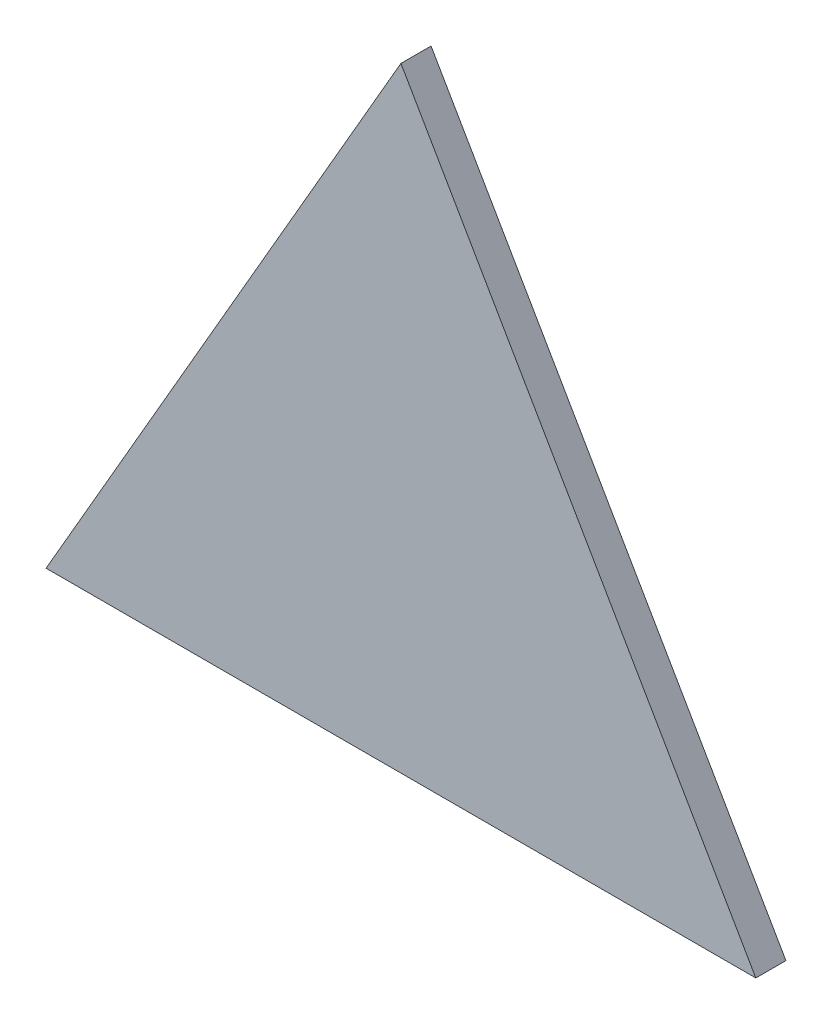
ISO-10303-21;
HEADER;
FILE_DESCRIPTION(('STEP AP214'),'2;1');
FILE_NAME('part.step','',(''),(''),'','','');
FILE_SCHEMA(('AUTOMOTIVE_DESIGN { 1 0 10303 214 1 1 1 1 }'));
ENDSEC;
DATA;
#1=APPLICATION_CONTEXT('core data for automotive mechanical design processes');
#2=APPLICATION_PROTOCOL_DEFINITION('international standard','automotive_design',2000,#1);
#3=PRODUCT_CONTEXT('',#1,'mechanical');
#4=PRODUCT('Part','Part','',(#3));
#5=PRODUCT_RELATED_PRODUCT_CATEGORY('part','',(#4));
#6=PRODUCT_DEFINITION_FORMATION('','',#4);
#7=PRODUCT_DEFINITION_CONTEXT('part definition',#1,'design');
#8=PRODUCT_DEFINITION('design','',#6,#7);
#9=PRODUCT_DEFINITION_SHAPE('','',#8);
#10=(LENGTH_UNIT() NAMED_UNIT(*) SI_UNIT(.MILLI.,.METRE.));
#11=(NAMED_UNIT(*) PLANE_ANGLE_UNIT() SI_UNIT($,.RADIAN.));
#12=(NAMED_UNIT(*) SI_UNIT($,.STERADIAN.) SOLID_ANGLE_UNIT());
#13=UNCERTAINTY_MEASURE_WITH_UNIT(LENGTH_MEASURE(1.E-05),#10,'distance_accuracy_value','');
#14=(GEOMETRIC_REPRESENTATION_CONTEXT(3) GLOBAL_UNCERTAINTY_ASSIGNED_CONTEXT((#13)) GLOBAL_UNIT_ASSIGNED_CONTEXT((#10,
#11,#12)) REPRESENTATION_CONTEXT('',''));
#15=CARTESIAN_POINT('',(0.,0.,0.));
#16=DIRECTION('',(0.,0.,1.));
#17=DIRECTION('',(1.,0.,0.));
#18=AXIS2_PLACEMENT_3D('',#15,#16,#17);
#19=CARTESIAN_POINT('',(-11.785,0.,1.));
#20=DIRECTION('',(0.86602540378444,-0.499999999999998,0.));
#21=DIRECTION('',(0.499999999999998,0.86602540378444,0.));
#22=AXIS2_PLACEMENT_3D('',#19,#20,#21);
#23=PLANE('',#22);
#24=DIRECTION('',(-0.499999999999998,-0.86602540378444,0.));
#25=VECTOR('',#24,1.);
#26=CARTESIAN_POINT('',(-11.785,0.,0.));
#27=LINE('',#26,#25);
#28=CARTESIAN_POINT('',(0.,20.4122187671993,0.));
#29=VERTEX_POINT('',#28);
#30=CARTESIAN_POINT('',(-11.785,0.,0.));
#31=VERTEX_POINT('',#30);
#32=EDGE_CURVE('E82',#29,#31,#27,.T.);
#33=ORIENTED_EDGE('',*,*,#32,.T.);
#34=DIRECTION('',(0.,0.,-1.));
#35=VECTOR('',#34,1.);
#36=CARTESIAN_POINT('',(-11.785,0.,1.));
#37=LINE('',#36,#35);
#38=CARTESIAN_POINT('',(-11.785,0.,1.));
#39=VERTEX_POINT('',#38);
#40=EDGE_CURVE('E11',#39,#31,#37,.T.);
#41=ORIENTED_EDGE('',*,*,#40,.F.);
#42=DIRECTION('',(-0.499999999999998,-0.86602540378444,0.));
#43=VECTOR('',#42,1.);
#44=CARTESIAN_POINT('',(-11.785,0.,1.));
#45=LINE('',#44,#43);
#46=CARTESIAN_POINT('',(0.,20.4122187671993,1.));
#47=VERTEX_POINT('',#46);
#48=EDGE_CURVE('E75',#47,#39,#45,.T.);
#49=ORIENTED_EDGE('',*,*,#48,.F.);
#50=DIRECTION('',(0.,0.,-1.));
#51=VECTOR('',#50,1.);
#52=CARTESIAN_POINT('',(0.,20.4122187671993,1.));
#53=LINE('',#52,#51);
#54=EDGE_CURVE('E83',#47,#29,#53,.T.);
#55=ORIENTED_EDGE('',*,*,#54,.T.);
#56=EDGE_LOOP('',(#33,#41,#49,#55));
#57=FACE_BOUND('',#56,.T.);
#58=ADVANCED_FACE('F35',(#57),#23,.F.);
#59=CARTESIAN_POINT('',(-11.785,0.,1.));
#60=DIRECTION('',(0.,1.,0.));
#61=DIRECTION('',(0.,0.,1.));
#62=AXIS2_PLACEMENT_3D('',#59,#60,#61);
#63=PLANE('',#62);
#64=DIRECTION('',(1.,0.,0.));
#65=VECTOR('',#64,1.);
#66=CARTESIAN_POINT('',(-11.785,0.,0.));
#67=LINE('',#66,#65);
#68=CARTESIAN_POINT('',(11.785,0.,0.));
#69=VERTEX_POINT('',#68);
#70=EDGE_CURVE('E63',#31,#69,#67,.T.);
#71=ORIENTED_EDGE('',*,*,#70,.T.);
#72=DIRECTION('',(0.,0.,-1.));
#73=VECTOR('',#72,1.);
#74=CARTESIAN_POINT('',(11.785,0.,1.));
#75=LINE('',#74,#73);
#76=CARTESIAN_POINT('',(11.785,0.,1.));
#77=VERTEX_POINT('',#76);
#78=EDGE_CURVE('E43',#77,#69,#75,.T.);
#79=ORIENTED_EDGE('',*,*,#78,.F.);
#80=DIRECTION('',(1.,0.,0.));
#81=VECTOR('',#80,1.);
#82=CARTESIAN_POINT('',(-11.785,0.,1.));
#83=LINE('',#82,#81);
#84=EDGE_CURVE('E71',#39,#77,#83,.T.);
#85=ORIENTED_EDGE('',*,*,#84,.F.);
#86=ORIENTED_EDGE('',*,*,#40,.T.);
#87=EDGE_LOOP('',(#71,#79,#85,#86));
#88=FACE_BOUND('',#87,.T.);
#89=ADVANCED_FACE('F72',(#88),#63,.F.);
#90=CARTESIAN_POINT('',(0.,20.4122187671993,1.));
#91=DIRECTION('',(-0.86602540378444,-0.499999999999998,0.));
#92=DIRECTION('',(0.499999999999998,-0.86602540378444,0.));
#93=AXIS2_PLACEMENT_3D('',#90,#91,#92);
#94=PLANE('',#93);
#95=DIRECTION('',(-0.499999999999998,0.86602540378444,0.));
#96=VECTOR('',#95,1.);
#97=CARTESIAN_POINT('',(0.,20.4122187671993,0.));
#98=LINE('',#97,#96);
#99=EDGE_CURVE('E68',#69,#29,#98,.T.);
#100=ORIENTED_EDGE('',*,*,#99,.T.);
#101=ORIENTED_EDGE('',*,*,#54,.F.);
#102=DIRECTION('',(-0.499999999999998,0.86602540378444,0.));
#103=VECTOR('',#102,1.);
#104=CARTESIAN_POINT('',(0.,20.4122187671993,1.));
#105=LINE('',#104,#103);
#106=EDGE_CURVE('E51',#77,#47,#105,.T.);
#107=ORIENTED_EDGE('',*,*,#106,.F.);
#108=ORIENTED_EDGE('',*,*,#78,.T.);
#109=EDGE_LOOP('',(#100,#101,#107,#108));
#110=FACE_BOUND('',#109,.T.);
#111=ADVANCED_FACE('F90',(#110),#94,.F.);
#112=CARTESIAN_POINT('',(0.,0.,1.));
#113=DIRECTION('',(0.,0.,-1.));
#114=DIRECTION('',(-1.,0.,0.));
#115=AXIS2_PLACEMENT_3D('',#112,#113,#114);
#116=PLANE('',#115);
#117=ORIENTED_EDGE('',*,*,#48,.T.);
#118=ORIENTED_EDGE('',*,*,#84,.T.);
#119=ORIENTED_EDGE('',*,*,#106,.T.);
#120=EDGE_LOOP('',(#117,#118,#119));
#121=FACE_BOUND('',#120,.T.);
#122=ADVANCED_FACE('F78',(#121),#116,.F.);
#123=CARTESIAN_POINT('',(0.,0.,0.));
#124=DIRECTION('',(0.,0.,-1.));
#125=DIRECTION('',(-1.,0.,0.));
#126=AXIS2_PLACEMENT_3D('',#123,#124,#125);
#127=PLANE('',#126);
#128=ORIENTED_EDGE('',*,*,#32,.F.);
#129=ORIENTED_EDGE('',*,*,#99,.F.);
#130=ORIENTED_EDGE('',*,*,#70,.F.);
#131=EDGE_LOOP('',(#128,#129,#130));
#132=FACE_BOUND('',#131,.T.);
#133=ADVANCED_FACE('F91',(#132),#127,.T.);
#134=CLOSED_SHELL('',(#58,#89,#111,#122,#133));
#135=MANIFOLD_SOLID_BREP('B2',#134);
#136=ADVANCED_BREP_SHAPE_REPRESENTATION('',(#18,#135),#14);
#137=SHAPE_DEFINITION_REPRESENTATION(#9,#136);
ENDSEC;
END-ISO-10303-21;
